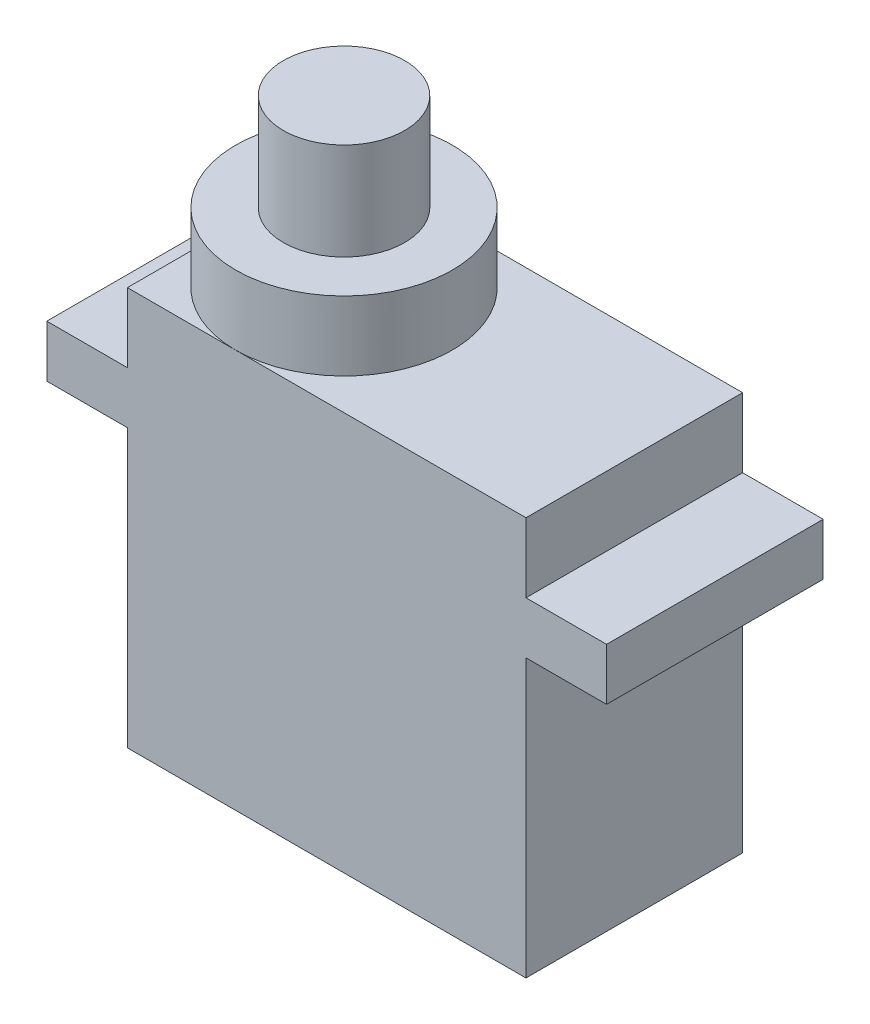
ISO-10303-21;
HEADER;
FILE_DESCRIPTION(('STEP AP214'),'2;1');
FILE_NAME('part.step','',(''),(''),'','','');
FILE_SCHEMA(('AUTOMOTIVE_DESIGN { 1 0 10303 214 1 1 1 1 }'));
ENDSEC;
DATA;
#1=APPLICATION_CONTEXT('core data for automotive mechanical design processes');
#2=APPLICATION_PROTOCOL_DEFINITION('international standard','automotive_design',2000,#1);
#3=PRODUCT_CONTEXT('',#1,'mechanical');
#4=PRODUCT('Part','Part','',(#3));
#5=PRODUCT_RELATED_PRODUCT_CATEGORY('part','',(#4));
#6=PRODUCT_DEFINITION_FORMATION('','',#4);
#7=PRODUCT_DEFINITION_CONTEXT('part definition',#1,'design');
#8=PRODUCT_DEFINITION('design','',#6,#7);
#9=PRODUCT_DEFINITION_SHAPE('','',#8);
#10=(LENGTH_UNIT() NAMED_UNIT(*) SI_UNIT(.MILLI.,.METRE.));
#11=(NAMED_UNIT(*) PLANE_ANGLE_UNIT() SI_UNIT($,.RADIAN.));
#12=(NAMED_UNIT(*) SI_UNIT($,.STERADIAN.) SOLID_ANGLE_UNIT());
#13=UNCERTAINTY_MEASURE_WITH_UNIT(LENGTH_MEASURE(1.E-05),#10,'distance_accuracy_value','');
#14=(GEOMETRIC_REPRESENTATION_CONTEXT(3) GLOBAL_UNCERTAINTY_ASSIGNED_CONTEXT((#13)) GLOBAL_UNIT_ASSIGNED_CONTEXT((#10,
#11,#12)) REPRESENTATION_CONTEXT('',''));
#15=CARTESIAN_POINT('',(0.,0.,0.));
#16=DIRECTION('',(0.,0.,1.));
#17=DIRECTION('',(1.,0.,0.));
#18=AXIS2_PLACEMENT_3D('',#15,#16,#17);
#19=CARTESIAN_POINT('',(0.,23.,0.));
#20=DIRECTION('',(0.,1.,0.));
#21=DIRECTION('',(0.,0.,1.));
#22=AXIS2_PLACEMENT_3D('',#19,#20,#21);
#23=PLANE('',#22);
#24=CARTESIAN_POINT('',(-4.49088144050447,23.,-0.0341530054644829));
#25=DIRECTION('',(0.,1.,0.));
#26=DIRECTION('',(0.,0.,1.));
#27=AXIS2_PLACEMENT_3D('',#24,#25,#26);
#28=CIRCLE('',#27,6.25);
#29=CARTESIAN_POINT('',(-4.49088144050447,23.,6.21584699453552));
#30=VERTEX_POINT('',#29);
#31=CARTESIAN_POINT('',(-4.49088144050447,23.,-6.28415300546448));
#32=VERTEX_POINT('',#31);
#33=EDGE_CURVE('E156',#30,#32,#28,.T.);
#34=ORIENTED_EDGE('',*,*,#33,.F.);
#35=DIRECTION('',(1.,0.,0.));
#36=VECTOR('',#35,1.);
#37=CARTESIAN_POINT('',(0.,23.,6.21584699453552));
#38=LINE('',#37,#36);
#39=CARTESIAN_POINT('',(12.2591185594955,23.,6.21584699453552));
#40=VERTEX_POINT('',#39);
#41=EDGE_CURVE('E145',#30,#40,#38,.T.);
#42=ORIENTED_EDGE('',*,*,#41,.T.);
#43=DIRECTION('',(0.,0.,1.));
#44=VECTOR('',#43,1.);
#45=CARTESIAN_POINT('',(12.2591185594955,23.,0.));
#46=LINE('',#45,#44);
#47=CARTESIAN_POINT('',(12.2591185594955,23.,-6.28415300546449));
#48=VERTEX_POINT('',#47);
#49=EDGE_CURVE('E144',#48,#40,#46,.T.);
#50=ORIENTED_EDGE('',*,*,#49,.F.);
#51=DIRECTION('',(1.,0.,0.));
#52=VECTOR('',#51,1.);
#53=CARTESIAN_POINT('',(0.,23.,-6.28415300546448));
#54=LINE('',#53,#52);
#55=EDGE_CURVE('E157',#32,#48,#54,.T.);
#56=ORIENTED_EDGE('',*,*,#55,.F.);
#57=EDGE_LOOP('',(#34,#42,#50,#56));
#58=FACE_BOUND('',#57,.T.);
#59=ADVANCED_FACE('F38',(#58),#23,.T.);
#60=CARTESIAN_POINT('',(-10.7408814405045,23.,-0.034153005464482));
#61=VERTEX_POINT('',#60);
#62=EDGE_CURVE('E47',#32,#61,#28,.T.);
#63=ORIENTED_EDGE('',*,*,#62,.F.);
#64=CARTESIAN_POINT('',(-10.7408814405045,23.,-6.28415300546448));
#65=VERTEX_POINT('',#64);
#66=EDGE_CURVE('E221',#65,#32,#54,.T.);
#67=ORIENTED_EDGE('',*,*,#66,.F.);
#68=DIRECTION('',(0.,0.,1.));
#69=VECTOR('',#68,1.);
#70=CARTESIAN_POINT('',(-10.7408814405045,23.,0.));
#71=LINE('',#70,#69);
#72=EDGE_CURVE('E223',#65,#61,#71,.T.);
#73=ORIENTED_EDGE('',*,*,#72,.T.);
#74=EDGE_LOOP('',(#63,#67,#73));
#75=FACE_BOUND('',#74,.T.);
#76=ADVANCED_FACE('F277',(#75),#23,.T.);
#77=CARTESIAN_POINT('',(12.2591185594955,23.,0.));
#78=DIRECTION('',(1.,0.,0.));
#79=DIRECTION('',(0.,0.,-1.));
#80=AXIS2_PLACEMENT_3D('',#77,#78,#79);
#81=PLANE('',#80);
#82=DIRECTION('',(0.,-1.,0.));
#83=VECTOR('',#82,1.);
#84=CARTESIAN_POINT('',(12.2591185594955,23.,-6.28415300546449));
#85=LINE('',#84,#83);
#86=CARTESIAN_POINT('',(12.2591185594955,16.,-6.28415300546449));
#87=VERTEX_POINT('',#86);
#88=CARTESIAN_POINT('',(12.2591185594955,0.,-6.28415300546449));
#89=VERTEX_POINT('',#88);
#90=EDGE_CURVE('E240',#87,#89,#85,.T.);
#91=ORIENTED_EDGE('',*,*,#90,.F.);
#92=DIRECTION('',(0.,0.,1.));
#93=VECTOR('',#92,1.);
#94=CARTESIAN_POINT('',(12.2591185594955,16.,0.));
#95=LINE('',#94,#93);
#96=CARTESIAN_POINT('',(12.2591185594955,16.,6.21584699453552));
#97=VERTEX_POINT('',#96);
#98=EDGE_CURVE('E170',#87,#97,#95,.T.);
#99=ORIENTED_EDGE('',*,*,#98,.T.);
#100=DIRECTION('',(0.,-1.,0.));
#101=VECTOR('',#100,1.);
#102=CARTESIAN_POINT('',(12.2591185594955,23.,6.21584699453552));
#103=LINE('',#102,#101);
#104=CARTESIAN_POINT('',(12.2591185594955,0.,6.21584699453552));
#105=VERTEX_POINT('',#104);
#106=EDGE_CURVE('E164',#97,#105,#103,.T.);
#107=ORIENTED_EDGE('',*,*,#106,.T.);
#108=DIRECTION('',(0.,0.,1.));
#109=VECTOR('',#108,1.);
#110=CARTESIAN_POINT('',(12.2591185594955,0.,0.));
#111=LINE('',#110,#109);
#112=EDGE_CURVE('E227',#89,#105,#111,.T.);
#113=ORIENTED_EDGE('',*,*,#112,.F.);
#114=EDGE_LOOP('',(#91,#99,#107,#113));
#115=FACE_BOUND('',#114,.T.);
#116=ADVANCED_FACE('F253',(#115),#81,.T.);
#117=CARTESIAN_POINT('',(-10.7408814405045,23.,0.));
#118=DIRECTION('',(1.,0.,0.));
#119=DIRECTION('',(0.,0.,-1.));
#120=AXIS2_PLACEMENT_3D('',#117,#118,#119);
#121=PLANE('',#120);
#122=DIRECTION('',(0.,0.,1.));
#123=VECTOR('',#122,1.);
#124=CARTESIAN_POINT('',(-10.7408814405045,16.,0.));
#125=LINE('',#124,#123);
#126=CARTESIAN_POINT('',(-10.7408814405045,16.,-6.28415300546448));
#127=VERTEX_POINT('',#126);
#128=CARTESIAN_POINT('',(-10.7408814405045,16.,6.21584699453552));
#129=VERTEX_POINT('',#128);
#130=EDGE_CURVE('E210',#127,#129,#125,.T.);
#131=ORIENTED_EDGE('',*,*,#130,.F.);
#132=DIRECTION('',(0.,-1.,0.));
#133=VECTOR('',#132,1.);
#134=CARTESIAN_POINT('',(-10.7408814405045,23.,-6.28415300546448));
#135=LINE('',#134,#133);
#136=CARTESIAN_POINT('',(-10.7408814405045,0.,-6.28415300546448));
#137=VERTEX_POINT('',#136);
#138=EDGE_CURVE('E237',#127,#137,#135,.T.);
#139=ORIENTED_EDGE('',*,*,#138,.T.);
#140=DIRECTION('',(0.,0.,1.));
#141=VECTOR('',#140,1.);
#142=CARTESIAN_POINT('',(-10.7408814405045,0.,0.));
#143=LINE('',#142,#141);
#144=CARTESIAN_POINT('',(-10.7408814405045,0.,6.21584699453552));
#145=VERTEX_POINT('',#144);
#146=EDGE_CURVE('E154',#137,#145,#143,.T.);
#147=ORIENTED_EDGE('',*,*,#146,.T.);
#148=DIRECTION('',(0.,-1.,0.));
#149=VECTOR('',#148,1.);
#150=CARTESIAN_POINT('',(-10.7408814405045,23.,6.21584699453552));
#151=LINE('',#150,#149);
#152=EDGE_CURVE('E225',#129,#145,#151,.T.);
#153=ORIENTED_EDGE('',*,*,#152,.F.);
#154=EDGE_LOOP('',(#131,#139,#147,#153));
#155=FACE_BOUND('',#154,.T.);
#156=ADVANCED_FACE('F262',(#155),#121,.F.);
#157=CARTESIAN_POINT('',(0.,23.,6.21584699453552));
#158=DIRECTION('',(0.,0.,-1.));
#159=DIRECTION('',(-1.,0.,0.));
#160=AXIS2_PLACEMENT_3D('',#157,#158,#159);
#161=PLANE('',#160);
#162=DIRECTION('',(1.,0.,0.));
#163=VECTOR('',#162,1.);
#164=CARTESIAN_POINT('',(0.,0.,6.21584699453552));
#165=LINE('',#164,#163);
#166=EDGE_CURVE('E218',#145,#105,#165,.T.);
#167=ORIENTED_EDGE('',*,*,#166,.T.);
#168=ORIENTED_EDGE('',*,*,#106,.F.);
#169=DIRECTION('',(-1.,0.,0.));
#170=VECTOR('',#169,1.);
#171=CARTESIAN_POINT('',(0.,16.,6.21584699453551));
#172=LINE('',#171,#170);
#173=CARTESIAN_POINT('',(16.9091185594955,16.,6.21584699453552));
#174=VERTEX_POINT('',#173);
#175=EDGE_CURVE('E180',#174,#97,#172,.T.);
#176=ORIENTED_EDGE('',*,*,#175,.F.);
#177=DIRECTION('',(0.,-1.,0.));
#178=VECTOR('',#177,1.);
#179=CARTESIAN_POINT('',(16.9091185594955,19.,6.21584699453552));
#180=LINE('',#179,#178);
#181=CARTESIAN_POINT('',(16.9091185594955,19.,6.21584699453552));
#182=VERTEX_POINT('',#181);
#183=EDGE_CURVE('E191',#182,#174,#180,.T.);
#184=ORIENTED_EDGE('',*,*,#183,.F.);
#185=DIRECTION('',(-1.,0.,0.));
#186=VECTOR('',#185,1.);
#187=CARTESIAN_POINT('',(0.,19.,6.21584699453551));
#188=LINE('',#187,#186);
#189=CARTESIAN_POINT('',(12.2591185594955,19.,6.21584699453552));
#190=VERTEX_POINT('',#189);
#191=EDGE_CURVE('E167',#182,#190,#188,.T.);
#192=ORIENTED_EDGE('',*,*,#191,.T.);
#193=EDGE_CURVE('E42',#40,#190,#103,.T.);
#194=ORIENTED_EDGE('',*,*,#193,.F.);
#195=ORIENTED_EDGE('',*,*,#41,.F.);
#196=CARTESIAN_POINT('',(-10.7408814405045,23.,6.21584699453552));
#197=VERTEX_POINT('',#196);
#198=EDGE_CURVE('E137',#197,#30,#38,.T.);
#199=ORIENTED_EDGE('',*,*,#198,.F.);
#200=CARTESIAN_POINT('',(-10.7408814405045,19.,6.21584699453552));
#201=VERTEX_POINT('',#200);
#202=EDGE_CURVE('E235',#197,#201,#151,.T.);
#203=ORIENTED_EDGE('',*,*,#202,.T.);
#204=DIRECTION('',(1.,0.,0.));
#205=VECTOR('',#204,1.);
#206=CARTESIAN_POINT('',(0.,19.,6.21584699453552));
#207=LINE('',#206,#205);
#208=CARTESIAN_POINT('',(-15.3908814405045,19.,6.21584699453552));
#209=VERTEX_POINT('',#208);
#210=EDGE_CURVE('E197',#209,#201,#207,.T.);
#211=ORIENTED_EDGE('',*,*,#210,.F.);
#212=DIRECTION('',(0.,-1.,0.));
#213=VECTOR('',#212,1.);
#214=CARTESIAN_POINT('',(-15.3908814405045,19.,6.21584699453552));
#215=LINE('',#214,#213);
#216=CARTESIAN_POINT('',(-15.3908814405045,16.,6.21584699453552));
#217=VERTEX_POINT('',#216);
#218=EDGE_CURVE('E216',#209,#217,#215,.T.);
#219=ORIENTED_EDGE('',*,*,#218,.T.);
#220=DIRECTION('',(1.,0.,0.));
#221=VECTOR('',#220,1.);
#222=CARTESIAN_POINT('',(0.,16.,6.21584699453552));
#223=LINE('',#222,#221);
#224=EDGE_CURVE('E208',#217,#129,#223,.T.);
#225=ORIENTED_EDGE('',*,*,#224,.T.);
#226=ORIENTED_EDGE('',*,*,#152,.T.);
#227=EDGE_LOOP('',(#167,#168,#176,#184,#192,#194,#195,#199,#203,#211,#219,#225,#226));
#228=FACE_BOUND('',#227,.T.);
#229=ADVANCED_FACE('F40',(#228),#161,.F.);
#230=DIRECTION('',(0.,0.,1.));
#231=VECTOR('',#230,1.);
#232=CARTESIAN_POINT('',(12.2591185594955,19.,0.));
#233=LINE('',#232,#231);
#234=CARTESIAN_POINT('',(12.2591185594955,19.,-6.28415300546449));
#235=VERTEX_POINT('',#234);
#236=EDGE_CURVE('E176',#235,#190,#233,.T.);
#237=ORIENTED_EDGE('',*,*,#236,.F.);
#238=EDGE_CURVE('E241',#48,#235,#85,.T.);
#239=ORIENTED_EDGE('',*,*,#238,.F.);
#240=ORIENTED_EDGE('',*,*,#49,.T.);
#241=ORIENTED_EDGE('',*,*,#193,.T.);
#242=EDGE_LOOP('',(#237,#239,#240,#241));
#243=FACE_BOUND('',#242,.T.);
#244=ADVANCED_FACE('F284',(#243),#81,.T.);
#245=CARTESIAN_POINT('',(0.,23.,-6.28415300546448));
#246=DIRECTION('',(0.,0.,-1.));
#247=DIRECTION('',(-1.,0.,0.));
#248=AXIS2_PLACEMENT_3D('',#245,#246,#247);
#249=PLANE('',#248);
#250=DIRECTION('',(1.,0.,0.));
#251=VECTOR('',#250,1.);
#252=CARTESIAN_POINT('',(0.,0.,-6.28415300546448));
#253=LINE('',#252,#251);
#254=EDGE_CURVE('E230',#137,#89,#253,.T.);
#255=ORIENTED_EDGE('',*,*,#254,.F.);
#256=ORIENTED_EDGE('',*,*,#138,.F.);
#257=DIRECTION('',(-1.,0.,0.));
#258=VECTOR('',#257,1.);
#259=CARTESIAN_POINT('',(0.,16.,-6.28415300546448));
#260=LINE('',#259,#258);
#261=CARTESIAN_POINT('',(-15.3908814405045,16.,-6.28415300546448));
#262=VERTEX_POINT('',#261);
#263=EDGE_CURVE('E198',#127,#262,#260,.T.);
#264=ORIENTED_EDGE('',*,*,#263,.T.);
#265=DIRECTION('',(0.,-1.,0.));
#266=VECTOR('',#265,1.);
#267=CARTESIAN_POINT('',(-15.3908814405045,19.,-6.28415300546448));
#268=LINE('',#267,#266);
#269=CARTESIAN_POINT('',(-15.3908814405045,19.,-6.28415300546448));
#270=VERTEX_POINT('',#269);
#271=EDGE_CURVE('E205',#270,#262,#268,.T.);
#272=ORIENTED_EDGE('',*,*,#271,.F.);
#273=DIRECTION('',(-1.,0.,0.));
#274=VECTOR('',#273,1.);
#275=CARTESIAN_POINT('',(0.,19.,-6.28415300546448));
#276=LINE('',#275,#274);
#277=CARTESIAN_POINT('',(-10.7408814405045,19.,-6.28415300546448));
#278=VERTEX_POINT('',#277);
#279=EDGE_CURVE('E203',#278,#270,#276,.T.);
#280=ORIENTED_EDGE('',*,*,#279,.F.);
#281=EDGE_CURVE('E238',#65,#278,#135,.T.);
#282=ORIENTED_EDGE('',*,*,#281,.F.);
#283=ORIENTED_EDGE('',*,*,#66,.T.);
#284=ORIENTED_EDGE('',*,*,#55,.T.);
#285=ORIENTED_EDGE('',*,*,#238,.T.);
#286=DIRECTION('',(1.,0.,0.));
#287=VECTOR('',#286,1.);
#288=CARTESIAN_POINT('',(0.,19.,-6.28415300546449));
#289=LINE('',#288,#287);
#290=CARTESIAN_POINT('',(16.9091185594955,19.,-6.28415300546448));
#291=VERTEX_POINT('',#290);
#292=EDGE_CURVE('E173',#235,#291,#289,.T.);
#293=ORIENTED_EDGE('',*,*,#292,.T.);
#294=DIRECTION('',(0.,-1.,0.));
#295=VECTOR('',#294,1.);
#296=CARTESIAN_POINT('',(16.9091185594955,19.,-6.28415300546448));
#297=LINE('',#296,#295);
#298=CARTESIAN_POINT('',(16.9091185594955,16.,-6.28415300546448));
#299=VERTEX_POINT('',#298);
#300=EDGE_CURVE('E179',#291,#299,#297,.T.);
#301=ORIENTED_EDGE('',*,*,#300,.T.);
#302=DIRECTION('',(1.,0.,0.));
#303=VECTOR('',#302,1.);
#304=CARTESIAN_POINT('',(0.,16.,-6.28415300546449));
#305=LINE('',#304,#303);
#306=EDGE_CURVE('E186',#87,#299,#305,.T.);
#307=ORIENTED_EDGE('',*,*,#306,.F.);
#308=ORIENTED_EDGE('',*,*,#90,.T.);
#309=EDGE_LOOP('',(#255,#256,#264,#272,#280,#282,#283,#284,#285,#293,#301,#307,#308));
#310=FACE_BOUND('',#309,.T.);
#311=ADVANCED_FACE('F249',(#310),#249,.T.);
#312=ORIENTED_EDGE('',*,*,#281,.T.);
#313=DIRECTION('',(0.,0.,1.));
#314=VECTOR('',#313,1.);
#315=CARTESIAN_POINT('',(-10.7408814405045,19.,0.));
#316=LINE('',#315,#314);
#317=EDGE_CURVE('E200',#278,#201,#316,.T.);
#318=ORIENTED_EDGE('',*,*,#317,.T.);
#319=ORIENTED_EDGE('',*,*,#202,.F.);
#320=EDGE_CURVE('E140',#61,#197,#71,.T.);
#321=ORIENTED_EDGE('',*,*,#320,.F.);
#322=ORIENTED_EDGE('',*,*,#72,.F.);
#323=EDGE_LOOP('',(#312,#318,#319,#321,#322));
#324=FACE_BOUND('',#323,.T.);
#325=ADVANCED_FACE('F276',(#324),#121,.F.);
#326=EDGE_CURVE('E55',#61,#30,#28,.T.);
#327=ORIENTED_EDGE('',*,*,#326,.F.);
#328=ORIENTED_EDGE('',*,*,#320,.T.);
#329=ORIENTED_EDGE('',*,*,#198,.T.);
#330=EDGE_LOOP('',(#327,#328,#329));
#331=FACE_BOUND('',#330,.T.);
#332=ADVANCED_FACE('F139',(#331),#23,.T.);
#333=CARTESIAN_POINT('',(0.,0.,0.));
#334=DIRECTION('',(0.,1.,0.));
#335=DIRECTION('',(0.,0.,1.));
#336=AXIS2_PLACEMENT_3D('',#333,#334,#335);
#337=PLANE('',#336);
#338=ORIENTED_EDGE('',*,*,#166,.F.);
#339=ORIENTED_EDGE('',*,*,#146,.F.);
#340=ORIENTED_EDGE('',*,*,#254,.T.);
#341=ORIENTED_EDGE('',*,*,#112,.T.);
#342=EDGE_LOOP('',(#338,#339,#340,#341));
#343=FACE_BOUND('',#342,.T.);
#344=ADVANCED_FACE('F258',(#343),#337,.F.);
#345=CARTESIAN_POINT('',(-15.3908814405045,19.,0.));
#346=DIRECTION('',(1.,0.,0.));
#347=DIRECTION('',(0.,0.,-1.));
#348=AXIS2_PLACEMENT_3D('',#345,#346,#347);
#349=PLANE('',#348);
#350=DIRECTION('',(0.,0.,1.));
#351=VECTOR('',#350,1.);
#352=CARTESIAN_POINT('',(-15.3908814405045,16.,0.));
#353=LINE('',#352,#351);
#354=EDGE_CURVE('E193',#262,#217,#353,.T.);
#355=ORIENTED_EDGE('',*,*,#354,.T.);
#356=ORIENTED_EDGE('',*,*,#218,.F.);
#357=DIRECTION('',(0.,0.,1.));
#358=VECTOR('',#357,1.);
#359=CARTESIAN_POINT('',(-15.3908814405045,19.,0.));
#360=LINE('',#359,#358);
#361=EDGE_CURVE('E194',#270,#209,#360,.T.);
#362=ORIENTED_EDGE('',*,*,#361,.F.);
#363=ORIENTED_EDGE('',*,*,#271,.T.);
#364=EDGE_LOOP('',(#355,#356,#362,#363));
#365=FACE_BOUND('',#364,.T.);
#366=ADVANCED_FACE('F268',(#365),#349,.F.);
#367=CARTESIAN_POINT('',(0.,19.,0.));
#368=DIRECTION('',(0.,1.,0.));
#369=DIRECTION('',(0.,0.,1.));
#370=AXIS2_PLACEMENT_3D('',#367,#368,#369);
#371=PLANE('',#370);
#372=ORIENTED_EDGE('',*,*,#361,.T.);
#373=ORIENTED_EDGE('',*,*,#210,.T.);
#374=ORIENTED_EDGE('',*,*,#317,.F.);
#375=ORIENTED_EDGE('',*,*,#279,.T.);
#376=EDGE_LOOP('',(#372,#373,#374,#375));
#377=FACE_BOUND('',#376,.T.);
#378=ADVANCED_FACE('F273',(#377),#371,.T.);
#379=CARTESIAN_POINT('',(0.,16.,0.));
#380=DIRECTION('',(0.,1.,0.));
#381=DIRECTION('',(0.,0.,1.));
#382=AXIS2_PLACEMENT_3D('',#379,#380,#381);
#383=PLANE('',#382);
#384=ORIENTED_EDGE('',*,*,#354,.F.);
#385=ORIENTED_EDGE('',*,*,#263,.F.);
#386=ORIENTED_EDGE('',*,*,#130,.T.);
#387=ORIENTED_EDGE('',*,*,#224,.F.);
#388=EDGE_LOOP('',(#384,#385,#386,#387));
#389=FACE_BOUND('',#388,.T.);
#390=ADVANCED_FACE('F270',(#389),#383,.F.);
#391=CARTESIAN_POINT('',(16.9091185594955,19.,0.));
#392=DIRECTION('',(1.,0.,0.));
#393=DIRECTION('',(0.,0.,-1.));
#394=AXIS2_PLACEMENT_3D('',#391,#392,#393);
#395=PLANE('',#394);
#396=DIRECTION('',(0.,0.,1.));
#397=VECTOR('',#396,1.);
#398=CARTESIAN_POINT('',(16.9091185594955,16.,0.));
#399=LINE('',#398,#397);
#400=EDGE_CURVE('E183',#299,#174,#399,.T.);
#401=ORIENTED_EDGE('',*,*,#400,.F.);
#402=ORIENTED_EDGE('',*,*,#300,.F.);
#403=DIRECTION('',(0.,0.,1.));
#404=VECTOR('',#403,1.);
#405=CARTESIAN_POINT('',(16.9091185594955,19.,0.));
#406=LINE('',#405,#404);
#407=EDGE_CURVE('E169',#291,#182,#406,.T.);
#408=ORIENTED_EDGE('',*,*,#407,.T.);
#409=ORIENTED_EDGE('',*,*,#183,.T.);
#410=EDGE_LOOP('',(#401,#402,#408,#409));
#411=FACE_BOUND('',#410,.T.);
#412=ADVANCED_FACE('F314',(#411),#395,.T.);
#413=CARTESIAN_POINT('',(0.,19.,0.));
#414=DIRECTION('',(0.,1.,0.));
#415=DIRECTION('',(0.,0.,1.));
#416=AXIS2_PLACEMENT_3D('',#413,#414,#415);
#417=PLANE('',#416);
#418=ORIENTED_EDGE('',*,*,#191,.F.);
#419=ORIENTED_EDGE('',*,*,#407,.F.);
#420=ORIENTED_EDGE('',*,*,#292,.F.);
#421=ORIENTED_EDGE('',*,*,#236,.T.);
#422=EDGE_LOOP('',(#418,#419,#420,#421));
#423=FACE_BOUND('',#422,.T.);
#424=ADVANCED_FACE('F309',(#423),#417,.T.);
#425=CARTESIAN_POINT('',(0.,16.,0.));
#426=DIRECTION('',(0.,1.,0.));
#427=DIRECTION('',(0.,0.,1.));
#428=AXIS2_PLACEMENT_3D('',#425,#426,#427);
#429=PLANE('',#428);
#430=ORIENTED_EDGE('',*,*,#175,.T.);
#431=ORIENTED_EDGE('',*,*,#98,.F.);
#432=ORIENTED_EDGE('',*,*,#306,.T.);
#433=ORIENTED_EDGE('',*,*,#400,.T.);
#434=EDGE_LOOP('',(#430,#431,#432,#433));
#435=FACE_BOUND('',#434,.T.);
#436=ADVANCED_FACE('F316',(#435),#429,.F.);
#437=CARTESIAN_POINT('',(-4.49088144050447,27.,-0.0341530054644829));
#438=DIRECTION('',(0.,-1.,0.));
#439=DIRECTION('',(0.,0.,-1.));
#440=AXIS2_PLACEMENT_3D('',#437,#438,#439);
#441=CYLINDRICAL_SURFACE('',#440,6.25);
#442=CARTESIAN_POINT('',(-4.49088144050447,27.,-0.0341530054644829));
#443=DIRECTION('',(0.,1.,0.));
#444=DIRECTION('',(0.,0.,1.));
#445=AXIS2_PLACEMENT_3D('',#442,#443,#444);
#446=CIRCLE('',#445,6.25);
#447=CARTESIAN_POINT('',(-4.49088144050447,27.,6.21584699453552));
#448=VERTEX_POINT('',#447);
#449=EDGE_CURVE('E160',#448,#448,#446,.T.);
#450=ORIENTED_EDGE('',*,*,#449,.F.);
#451=EDGE_LOOP('',(#450));
#452=FACE_BOUND('',#451,.T.);
#453=ORIENTED_EDGE('',*,*,#33,.T.);
#454=ORIENTED_EDGE('',*,*,#62,.T.);
#455=ORIENTED_EDGE('',*,*,#326,.T.);
#456=EDGE_LOOP('',(#453,#454,#455));
#457=FACE_BOUND('',#456,.T.);
#458=ADVANCED_FACE('F163',(#452,#457),#441,.T.);
#459=CARTESIAN_POINT('',(-4.49088144050447,27.,-0.0341530054644829));
#460=DIRECTION('',(0.,1.,0.));
#461=DIRECTION('',(0.,0.,1.));
#462=AXIS2_PLACEMENT_3D('',#459,#460,#461);
#463=PLANE('',#462);
#464=CARTESIAN_POINT('',(-4.49088144050447,27.,-0.0341530054644829));
#465=DIRECTION('',(0.,1.,0.));
#466=DIRECTION('',(0.,0.,1.));
#467=AXIS2_PLACEMENT_3D('',#464,#465,#466);
#468=CIRCLE('',#467,3.5);
#469=CARTESIAN_POINT('',(-4.49088144050447,27.,3.46584699453552));
#470=VERTEX_POINT('',#469);
#471=EDGE_CURVE('E11',#470,#470,#468,.T.);
#472=ORIENTED_EDGE('',*,*,#471,.F.);
#473=EDGE_LOOP('',(#472));
#474=FACE_BOUND('',#473,.T.);
#475=ORIENTED_EDGE('',*,*,#449,.T.);
#476=EDGE_LOOP('',(#475));
#477=FACE_BOUND('',#476,.T.);
#478=ADVANCED_FACE('F323',(#474,#477),#463,.T.);
#479=CARTESIAN_POINT('',(-4.49088144050447,32.6,-0.0341530054644829));
#480=DIRECTION('',(0.,-1.,0.));
#481=DIRECTION('',(0.,0.,-1.));
#482=AXIS2_PLACEMENT_3D('',#479,#480,#481);
#483=CYLINDRICAL_SURFACE('',#482,3.5);
#484=CARTESIAN_POINT('',(-4.49088144050447,32.6,-0.0341530054644829));
#485=DIRECTION('',(0.,1.,0.));
#486=DIRECTION('',(0.,0.,1.));
#487=AXIS2_PLACEMENT_3D('',#484,#485,#486);
#488=CIRCLE('',#487,3.5);
#489=CARTESIAN_POINT('',(-4.49088144050447,32.6,3.46584699453552));
#490=VERTEX_POINT('',#489);
#491=EDGE_CURVE('E161',#490,#490,#488,.T.);
#492=ORIENTED_EDGE('',*,*,#491,.F.);
#493=EDGE_LOOP('',(#492));
#494=FACE_BOUND('',#493,.T.);
#495=ORIENTED_EDGE('',*,*,#471,.T.);
#496=EDGE_LOOP('',(#495));
#497=FACE_BOUND('',#496,.T.);
#498=ADVANCED_FACE('F411',(#494,#497),#483,.T.);
#499=CARTESIAN_POINT('',(-4.49088144050447,32.6,-0.0341530054644829));
#500=DIRECTION('',(0.,1.,0.));
#501=DIRECTION('',(0.,0.,1.));
#502=AXIS2_PLACEMENT_3D('',#499,#500,#501);
#503=PLANE('',#502);
#504=ORIENTED_EDGE('',*,*,#491,.T.);
#505=EDGE_LOOP('',(#504));
#506=FACE_BOUND('',#505,.T.);
#507=ADVANCED_FACE('F421',(#506),#503,.T.);
#508=CLOSED_SHELL('',(#59,#76,#116,#156,#229,#244,#311,#325,#332,#344,#366,#378,#390,#412,#424,
#436,#458,#478,#498,#507));
#509=MANIFOLD_SOLID_BREP('B2',#508);
#510=ADVANCED_BREP_SHAPE_REPRESENTATION('',(#18,#509),#14);
#511=SHAPE_DEFINITION_REPRESENTATION(#9,#510);
ENDSEC;
END-ISO-10303-21;
